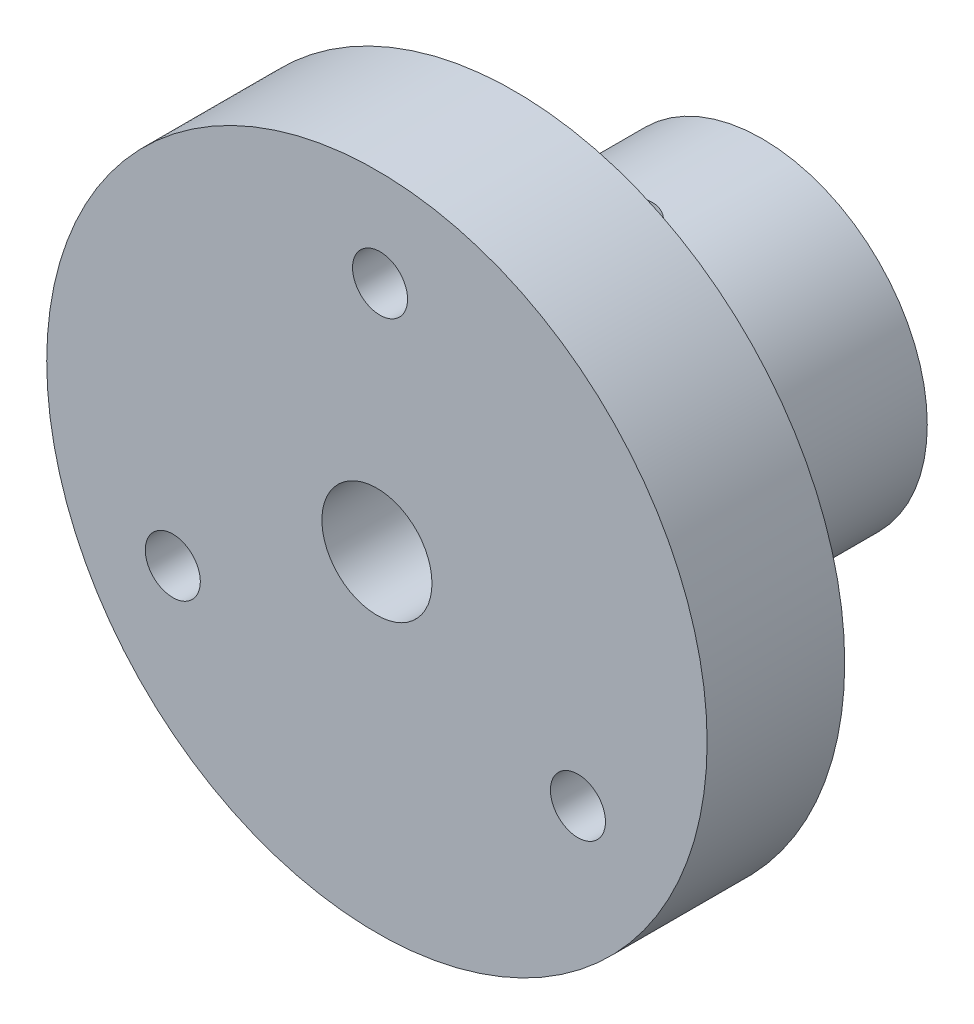
ISO-10303-21;
HEADER;
FILE_DESCRIPTION(('STEP AP214'),'2;1');
FILE_NAME('part.step','',(''),(''),'','','');
FILE_SCHEMA(('AUTOMOTIVE_DESIGN { 1 0 10303 214 1 1 1 1 }'));
ENDSEC;
DATA;
#1=APPLICATION_CONTEXT('core data for automotive mechanical design processes');
#2=APPLICATION_PROTOCOL_DEFINITION('international standard','automotive_design',2000,#1);
#3=PRODUCT_CONTEXT('',#1,'mechanical');
#4=PRODUCT('Part','Part','',(#3));
#5=PRODUCT_RELATED_PRODUCT_CATEGORY('part','',(#4));
#6=PRODUCT_DEFINITION_FORMATION('','',#4);
#7=PRODUCT_DEFINITION_CONTEXT('part definition',#1,'design');
#8=PRODUCT_DEFINITION('design','',#6,#7);
#9=PRODUCT_DEFINITION_SHAPE('','',#8);
#10=(LENGTH_UNIT() NAMED_UNIT(*) SI_UNIT(.MILLI.,.METRE.));
#11=(NAMED_UNIT(*) PLANE_ANGLE_UNIT() SI_UNIT($,.RADIAN.));
#12=(NAMED_UNIT(*) SI_UNIT($,.STERADIAN.) SOLID_ANGLE_UNIT());
#13=UNCERTAINTY_MEASURE_WITH_UNIT(LENGTH_MEASURE(1.E-05),#10,'distance_accuracy_value','');
#14=(GEOMETRIC_REPRESENTATION_CONTEXT(3) GLOBAL_UNCERTAINTY_ASSIGNED_CONTEXT((#13)) GLOBAL_UNIT_ASSIGNED_CONTEXT((#10,
#11,#12)) REPRESENTATION_CONTEXT('',''));
#15=CARTESIAN_POINT('',(0.,0.,0.));
#16=DIRECTION('',(0.,0.,1.));
#17=DIRECTION('',(1.,0.,0.));
#18=AXIS2_PLACEMENT_3D('',#15,#16,#17);
#19=CARTESIAN_POINT('',(-41.1434716879408,10.1614064230343,25.9705627484771));
#20=DIRECTION('',(0.,0.,-1.));
#21=DIRECTION('',(-1.,0.,0.));
#22=AXIS2_PLACEMENT_3D('',#19,#20,#21);
#23=CYLINDRICAL_SURFACE('',#22,6.);
#24=CARTESIAN_POINT('',(-42.1434716879407,16.077486206134,5.));
#25=CARTESIAN_POINT('',(-42.1434694473091,16.0774872126394,4.94424970074159));
#26=CARTESIAN_POINT('',(-42.1387937555557,16.0782827932266,4.88846895759005));
#27=CARTESIAN_POINT('',(-42.1202226591709,16.081376252507,4.77847258271193));
#28=CARTESIAN_POINT('',(-42.1063187520646,16.0836755166,4.72425844250019));
#29=CARTESIAN_POINT('',(-42.0697235054076,16.0895088603236,4.61900308665729));
#30=CARTESIAN_POINT('',(-42.0470395099132,16.0930419077221,4.56795926053347));
#31=CARTESIAN_POINT('',(-41.9935462866969,16.1009435114917,4.47040761811451));
#32=CARTESIAN_POINT('',(-41.9627379733414,16.1053119738242,4.4238992921695));
#33=CARTESIAN_POINT('',(-41.8935466987272,16.1144403076448,4.33627486010173));
#34=CARTESIAN_POINT('',(-41.8550993075136,16.1192032923426,4.29520994744539));
#35=CARTESIAN_POINT('',(-41.7718604898189,16.1285563457122,4.22008267725539));
#36=CARTESIAN_POINT('',(-41.7270686876007,16.1331464041222,4.18602073475386));
#37=CARTESIAN_POINT('',(-41.6320808359201,16.1416693709642,4.12567417311226));
#38=CARTESIAN_POINT('',(-41.5818541205234,16.1455981927634,4.09943719690727));
#39=CARTESIAN_POINT('',(-41.4776299366303,16.1523213708629,4.05579157178779));
#40=CARTESIAN_POINT('',(-41.423632713572,16.155115800925,4.03838234884605));
#41=CARTESIAN_POINT('',(-41.3139291784784,16.1592333619319,4.01304298600644));
#42=CARTESIAN_POINT('',(-41.2582432426124,16.160569835478,4.00502683359812));
#43=CARTESIAN_POINT('',(-41.146301802151,16.1616667404055,3.99843369833896));
#44=CARTESIAN_POINT('',(-41.0900463365292,16.1614272789116,3.99985607390111));
#45=CARTESIAN_POINT('',(-40.9791508139092,16.1594098567599,4.01203254061129));
#46=CARTESIAN_POINT('',(-40.9245002756607,16.1576471578039,4.02269406536366));
#47=CARTESIAN_POINT('',(-40.817774896096,16.1527983381209,4.0529004296986));
#48=CARTESIAN_POINT('',(-40.7657001332801,16.1497121770872,4.0724455398358));
#49=CARTESIAN_POINT('',(-40.6653292288277,16.1425372170822,4.11995625612613));
#50=CARTESIAN_POINT('',(-40.6170514787331,16.1384438923418,4.14796000483298));
#51=CARTESIAN_POINT('',(-40.5258454760021,16.1297093753203,4.21156512905402));
#52=CARTESIAN_POINT('',(-40.4829176567744,16.1250681387109,4.24716711948433));
#53=CARTESIAN_POINT('',(-40.4030831785621,16.1156874959647,4.32547152264772));
#54=CARTESIAN_POINT('',(-40.3662558870395,16.1109475819585,4.36825483796039));
#55=CARTESIAN_POINT('',(-40.3002898525615,16.1019582621735,4.45943483608633));
#56=CARTESIAN_POINT('',(-40.2711511805278,16.0977088609196,4.50783157067313));
#57=CARTESIAN_POINT('',(-40.2213739141454,16.0901814412816,4.60895665675099));
#58=CARTESIAN_POINT('',(-40.200744877029,16.0869045162447,4.66168979923684));
#59=CARTESIAN_POINT('',(-40.1686597396145,16.0817111777938,4.76993962892302));
#60=CARTESIAN_POINT('',(-40.1572028316335,16.0797946445876,4.82545607057297));
#61=CARTESIAN_POINT('',(-40.143898933989,16.0775622607228,4.93698646246486));
#62=CARTESIAN_POINT('',(-40.1419388047758,16.077227566069,4.99298655188085));
#63=CARTESIAN_POINT('',(-40.1473826068678,16.0781465621638,5.10451466867633));
#64=CARTESIAN_POINT('',(-40.1547861764909,16.0794001915617,5.16004271420559));
#65=CARTESIAN_POINT('',(-40.1786507539695,16.0833371728544,5.26869110367635));
#66=CARTESIAN_POINT('',(-40.1950541716822,16.0860114307077,5.32182445595121));
#67=CARTESIAN_POINT('',(-40.2363924118638,16.0924807150563,5.4245880665118));
#68=CARTESIAN_POINT('',(-40.2613277447004,16.0962758085966,5.47421811502036));
#69=CARTESIAN_POINT('',(-40.319289018649,16.1046029366239,5.56906983776245));
#70=CARTESIAN_POINT('',(-40.352387462277,16.1091414454357,5.61424662910242));
#71=CARTESIAN_POINT('',(-40.4256359016575,16.1184250897538,5.698445413078));
#72=CARTESIAN_POINT('',(-40.4657863933871,16.1231702397757,5.7374669724439));
#73=CARTESIAN_POINT('',(-40.5525004598092,16.1323921115074,5.80866075709148));
#74=CARTESIAN_POINT('',(-40.5991263865863,16.136865528413,5.84075753051382));
#75=CARTESIAN_POINT('',(-40.697174308761,16.1449868727661,5.89666213080195));
#76=CARTESIAN_POINT('',(-40.7485961489525,16.1486348269142,5.92047022578954));
#77=CARTESIAN_POINT('',(-40.8545520673402,16.1546798557127,5.95900423358195));
#78=CARTESIAN_POINT('',(-40.9090714628997,16.1570823613048,5.97376963029397));
#79=CARTESIAN_POINT('',(-41.019859393991,16.1603887557115,5.99392623958553));
#80=CARTESIAN_POINT('',(-41.0761277852121,16.161292767835,5.99931822349294));
#81=CARTESIAN_POINT('',(-41.1880881982502,16.1614985745856,6.00055275292487));
#82=CARTESIAN_POINT('',(-41.2437789521818,16.1608196311313,5.99651010157642));
#83=CARTESIAN_POINT('',(-41.3536764776666,16.1579751365835,5.97923843109224));
#84=CARTESIAN_POINT('',(-41.4078832575277,16.1558095938143,5.96600946339617));
#85=CARTESIAN_POINT('',(-41.5132302663082,16.1502343783447,5.93078473378249));
#86=CARTESIAN_POINT('',(-41.5643738368023,16.1468260912006,5.90879873271582));
#87=CARTESIAN_POINT('',(-41.6622638691335,16.1391374505437,5.85669682550792));
#88=CARTESIAN_POINT('',(-41.7090101223877,16.1348570556939,5.82658053397561));
#89=CARTESIAN_POINT('',(-41.7973568661516,16.1258369415102,5.7586659630152));
#90=CARTESIAN_POINT('',(-41.838892260183,16.1210925212373,5.72078361809725));
#91=CARTESIAN_POINT('',(-41.9150572383199,16.1117116362533,5.63858867684072));
#92=CARTESIAN_POINT('',(-41.9496852026212,16.1070751970887,5.59427457644338));
#93=CARTESIAN_POINT('',(-42.0112773963086,16.0983997973147,5.50010187099694));
#94=CARTESIAN_POINT('',(-42.0381856835785,16.0943652949593,5.45020626406478));
#95=CARTESIAN_POINT('',(-42.0831975025171,16.0874032639214,5.34655630563542));
#96=CARTESIAN_POINT('',(-42.1013098300334,16.0844746300394,5.29280587092124));
#97=CARTESIAN_POINT('',(-42.1242821091896,16.0807054023855,5.19903849220933));
#98=CARTESIAN_POINT('',(-42.1314666550088,16.0795049167184,5.15958927681662));
#99=CARTESIAN_POINT('',(-42.1410622060137,16.0778949641804,5.08009860606356));
#100=CARTESIAN_POINT('',(-42.1434732978575,16.0774854829494,5.04005716146793));
#101=CARTESIAN_POINT('',(-42.1434716879407,16.077486206134,5.));
#102=B_SPLINE_CURVE_WITH_KNOTS('',3,(#24,#25,#26,#27,#28,#29,#30,#31,#32,#33,#34,#35,#36,#37,
#38,#39,#40,#41,#42,#43,#44,#45,#46,#47,#48,#49,#50,#51,#52,#53,#54,#55,#56,#57,#58,#59,#60,#61,
#62,#63,#64,#65,#66,#67,#68,#69,#70,#71,#72,#73,#74,#75,#76,#77,#78,#79,#80,#81,#82,#83,#84,#85,
#86,#87,#88,#89,#90,#91,#92,#93,#94,#95,#96,#97,#98,#99,#100,#101),.UNSPECIFIED.,.T.,.F.,(4,2,2,
2,2,2,2,2,2,2,2,2,2,2,2,2,2,2,2,2,2,2,2,2,2,2,2,2,2,2,2,2,2,2,2,2,2,2,4),(0.,0.167104415562128,
0.334363007967781,0.501481999132675,0.66858218960369,0.83715663660545,1.00574107132038,
1.17533192042833,1.34491174042705,1.51292626987286,1.68092937859336,1.84726848464127,
2.01361265698072,2.18071841654029,2.34783770488964,2.51698449383108,2.68613284296667,
2.855470649977,3.0247935437349,3.19209416966423,3.35938833363849,3.52562425852455,
3.69187012915688,3.8596493710334,4.02744041770535,4.19697645212412,4.36650700188938,
4.53529193765317,4.70406298363199,4.87079110504625,5.03751829285788,5.20406015931241,
5.37060992155192,5.53906798983559,5.70756551550983,5.87725491045139,6.0467742669505,
6.16684268214774,6.28690891757995),.UNSPECIFIED.);
#103=CARTESIAN_POINT('',(-42.1434716879407,16.077486206134,5.));
#104=VERTEX_POINT('',#103);
#105=EDGE_CURVE('E76',#104,#104,#102,.T.);
#106=ORIENTED_EDGE('',*,*,#105,.T.);
#107=EDGE_LOOP('',(#106));
#108=FACE_BOUND('',#107,.T.);
#109=CARTESIAN_POINT('',(-41.1434716879408,10.1614064230343,0.));
#110=DIRECTION('',(0.,0.,1.));
#111=DIRECTION('',(1.,0.,0.));
#112=AXIS2_PLACEMENT_3D('',#109,#110,#111);
#113=CIRCLE('',#112,6.);
#114=CARTESIAN_POINT('',(-35.1434716879408,10.1614064230343,0.));
#115=VERTEX_POINT('',#114);
#116=EDGE_CURVE('E54',#115,#115,#113,.T.);
#117=ORIENTED_EDGE('',*,*,#116,.T.);
#118=EDGE_LOOP('',(#117));
#119=FACE_BOUND('',#118,.T.);
#120=CARTESIAN_POINT('',(-41.1434716879408,10.1614064230343,9.));
#121=DIRECTION('',(0.,0.,1.));
#122=DIRECTION('',(1.,0.,0.));
#123=AXIS2_PLACEMENT_3D('',#120,#121,#122);
#124=CIRCLE('',#123,6.);
#125=CARTESIAN_POINT('',(-35.1434716879408,10.1614064230343,9.));
#126=VERTEX_POINT('',#125);
#127=EDGE_CURVE('E12',#126,#126,#124,.T.);
#128=ORIENTED_EDGE('',*,*,#127,.F.);
#129=EDGE_LOOP('',(#128));
#130=FACE_BOUND('',#129,.T.);
#131=ADVANCED_FACE('F42',(#108,#119,#130),#23,.T.);
#132=CARTESIAN_POINT('',(-41.1434716879408,10.1614064230343,0.));
#133=DIRECTION('',(0.,0.,1.));
#134=DIRECTION('',(1.,0.,0.));
#135=AXIS2_PLACEMENT_3D('',#132,#133,#134);
#136=PLANE('',#135);
#137=ORIENTED_EDGE('',*,*,#116,.F.);
#138=EDGE_LOOP('',(#137));
#139=FACE_BOUND('',#138,.T.);
#140=CARTESIAN_POINT('',(-41.1434716879408,10.1614064230343,0.));
#141=DIRECTION('',(0.,0.,1.));
#142=DIRECTION('',(1.,0.,0.));
#143=AXIS2_PLACEMENT_3D('',#140,#141,#142);
#144=CIRCLE('',#143,2.);
#145=CARTESIAN_POINT('',(-39.1434716879408,10.1614064230343,0.));
#146=VERTEX_POINT('',#145);
#147=EDGE_CURVE('E59',#146,#146,#144,.T.);
#148=ORIENTED_EDGE('',*,*,#147,.T.);
#149=EDGE_LOOP('',(#148));
#150=FACE_BOUND('',#149,.T.);
#151=ADVANCED_FACE('F106',(#139,#150),#136,.F.);
#152=CARTESIAN_POINT('',(-41.1434716879408,10.1614064230343,25.9705627484771));
#153=DIRECTION('',(0.,0.,-1.));
#154=DIRECTION('',(-1.,0.,0.));
#155=AXIS2_PLACEMENT_3D('',#152,#153,#154);
#156=CYLINDRICAL_SURFACE('',#155,2.);
#157=CARTESIAN_POINT('',(-42.1434716879408,11.8934572306032,5.));
#158=CARTESIAN_POINT('',(-42.1434680510153,11.8934617703189,4.94789219180475));
#159=CARTESIAN_POINT('',(-42.139371658674,11.8958444349119,4.89571858847495));
#160=CARTESIAN_POINT('',(-42.1231948978388,11.9050300875549,4.79297273532285));
#161=CARTESIAN_POINT('',(-42.1110977524949,11.9118423635899,4.74240408495659));
#162=CARTESIAN_POINT('',(-42.0795716366406,11.9288998890883,4.64454833565606));
#163=CARTESIAN_POINT('',(-42.0601816404345,11.9391268577669,4.59724534752642));
#164=CARTESIAN_POINT('',(-42.0147392133171,11.9618330712029,4.50657579800328));
#165=CARTESIAN_POINT('',(-41.9886864219765,11.974312437795,4.46320944973754));
#166=CARTESIAN_POINT('',(-41.9281382284716,12.0013751136088,4.3776942714425));
#167=CARTESIAN_POINT('',(-41.8931237240845,12.0160470594139,4.33594086432646));
#168=CARTESIAN_POINT('',(-41.8167254955552,12.0451262508914,4.25859161159329));
#169=CARTESIAN_POINT('',(-41.7753386137231,12.0595333613468,4.22299883741648));
#170=CARTESIAN_POINT('',(-41.6839612513553,12.0876211925638,4.15663284885234));
#171=CARTESIAN_POINT('',(-41.6335788769533,12.1011874872161,4.12634623214047));
#172=CARTESIAN_POINT('',(-41.5276287145403,12.1249139840296,4.07485914675424));
#173=CARTESIAN_POINT('',(-41.4720642260789,12.1350763348717,4.05365294386283));
#174=CARTESIAN_POINT('',(-41.3615166318667,12.1502110354767,4.0224953386989));
#175=CARTESIAN_POINT('',(-41.3067734784296,12.1555012252433,4.01185047364447));
#176=CARTESIAN_POINT('',(-41.1960423166386,12.161482261495,3.99983388132496));
#177=CARTESIAN_POINT('',(-41.140055082097,12.1621758908802,3.99845654320429));
#178=CARTESIAN_POINT('',(-41.033639163517,12.1590362421988,4.00474667397035));
#179=CARTESIAN_POINT('',(-40.983150488764,12.1555913819559,4.01163801552123));
#180=CARTESIAN_POINT('',(-40.8841579160224,12.1451488756318,4.03288084390466));
#181=CARTESIAN_POINT('',(-40.8356541668468,12.1381509636983,4.04723288897622));
#182=CARTESIAN_POINT('',(-40.7411622963712,12.1211222559109,4.08308256608982));
#183=CARTESIAN_POINT('',(-40.6952182644256,12.1110508383263,4.10467631317207));
#184=CARTESIAN_POINT('',(-40.6074948864274,12.0887828829012,4.15426341620149));
#185=CARTESIAN_POINT('',(-40.5657170391021,12.0765855846092,4.18225906330235));
#186=CARTESIAN_POINT('',(-40.4832980270426,12.0498503670266,4.24689535153301));
#187=CARTESIAN_POINT('',(-40.4431376129114,12.0352001830161,4.28410302832601));
#188=CARTESIAN_POINT('',(-40.369367317643,12.0059498289024,4.36458972493017));
#189=CARTESIAN_POINT('',(-40.3357624763665,11.9913497056906,4.40787337227406));
#190=CARTESIAN_POINT('',(-40.2739663532986,11.9628479839592,4.50264819242409));
#191=CARTESIAN_POINT('',(-40.2462543729627,11.9490496229414,4.55448602305421));
#192=CARTESIAN_POINT('',(-40.2001525749395,11.9251609258201,4.662937671359));
#193=CARTESIAN_POINT('',(-40.1817530297299,11.915066723495,4.71954643301756));
#194=CARTESIAN_POINT('',(-40.1562914769157,11.9008527812047,4.83121451128279));
#195=CARTESIAN_POINT('',(-40.1484465658208,11.8963229815193,4.88604111904355));
#196=CARTESIAN_POINT('',(-40.1419547413293,11.8925856166504,4.99640134151654));
#197=CARTESIAN_POINT('',(-40.1433013306257,11.8933742919274,5.05193442911979));
#198=CARTESIAN_POINT('',(-40.1544356445968,11.8997497884402,5.15565391857873));
#199=CARTESIAN_POINT('',(-40.1632838712283,11.9048022981009,5.20397945110793));
#200=CARTESIAN_POINT('',(-40.1877754033083,11.9183466385477,5.29836778627096));
#201=CARTESIAN_POINT('',(-40.2034209093172,11.9268395830847,5.34442985074661));
#202=CARTESIAN_POINT('',(-40.2418240993359,11.9467686438309,5.4354113309027));
#203=CARTESIAN_POINT('',(-40.264877624248,11.958322855465,5.48017901685355));
#204=CARTESIAN_POINT('',(-40.317184623925,11.9829676180068,5.56546927153899));
#205=CARTESIAN_POINT('',(-40.3464412836085,11.9960589565858,5.60598964351328));
#206=CARTESIAN_POINT('',(-40.4146345207419,12.0242864075977,5.68697876752355));
#207=CARTESIAN_POINT('',(-40.4543264156258,12.0394722545772,5.72679715071767));
#208=CARTESIAN_POINT('',(-40.5400671925425,12.0687487728133,5.7994122379936));
#209=CARTESIAN_POINT('',(-40.5861182132854,12.0828390731114,5.83220657023054));
#210=CARTESIAN_POINT('',(-40.684936325382,12.1088200399439,5.8905737259501));
#211=CARTESIAN_POINT('',(-40.7378485903667,12.1206428397546,5.91593311821091));
#212=CARTESIAN_POINT('',(-40.8479493232997,12.1402399726273,5.95713790385739));
#213=CARTESIAN_POINT('',(-40.9051339865486,12.1480178597981,5.9729916513663));
#214=CARTESIAN_POINT('',(-41.0164920056103,12.1580815048532,5.99336856417466));
#215=CARTESIAN_POINT('',(-41.0704602440903,12.1608057021162,5.99879787587611));
#216=CARTESIAN_POINT('',(-41.178597673892,12.1618277267856,6.0008432654544));
#217=CARTESIAN_POINT('',(-41.2327667882358,12.1601271037032,5.99746242852356));
#218=CARTESIAN_POINT('',(-41.3360096802579,12.1527461114136,5.98258359320438));
#219=CARTESIAN_POINT('',(-41.385184005752,12.1473353697142,5.97163515074233));
#220=CARTESIAN_POINT('',(-41.4809176401244,12.1333273596686,5.94267300069703));
#221=CARTESIAN_POINT('',(-41.5274765728963,12.1247296343623,5.92465827990654));
#222=CARTESIAN_POINT('',(-41.6188950941856,12.1046657305155,5.88127294783402));
#223=CARTESIAN_POINT('',(-41.6635968306408,12.0930925950223,5.85562067679216));
#224=CARTESIAN_POINT('',(-41.7482463297548,12.0682877544526,5.79804206914095));
#225=CARTESIAN_POINT('',(-41.7881918953557,12.0550552886179,5.76611285088433));
#226=CARTESIAN_POINT('',(-41.8663856920977,12.0266925253006,5.6932028609773));
#227=CARTESIAN_POINT('',(-41.90406937248,12.0115044131513,5.65163751252281));
#228=CARTESIAN_POINT('',(-41.9721349753354,11.9820371846629,5.56254927887023));
#229=CARTESIAN_POINT('',(-42.0025104379508,11.967758880653,5.51502117913232));
#230=CARTESIAN_POINT('',(-42.0559027677264,11.9414024760835,5.41336335341904));
#231=CARTESIAN_POINT('',(-42.0786567539017,11.929408165597,5.35907246887126));
#232=CARTESIAN_POINT('',(-42.1143503974472,11.9100679863179,5.24666759566022));
#233=CARTESIAN_POINT('',(-42.1273228791161,11.9027065845114,5.18856711108731));
#234=CARTESIAN_POINT('',(-42.1378386958052,11.8966991490522,5.108194644348));
#235=CARTESIAN_POINT('',(-42.1399477929046,11.8954877130859,5.08663210560212));
#236=CARTESIAN_POINT('',(-42.1427650930307,11.8938657819118,5.04338351931776));
#237=CARTESIAN_POINT('',(-42.1434732023406,11.8934553402854,5.02169746361413));
#238=CARTESIAN_POINT('',(-42.1434716879408,11.8934572306032,5.));
#239=B_SPLINE_CURVE_WITH_KNOTS('',3,(#157,#158,#159,#160,#161,#162,#163,#164,#165,#166,#167,
#168,#169,#170,#171,#172,#173,#174,#175,#176,#177,#178,#179,#180,#181,#182,#183,#184,#185,#186,
#187,#188,#189,#190,#191,#192,#193,#194,#195,#196,#197,#198,#199,#200,#201,#202,#203,#204,#205,
#206,#207,#208,#209,#210,#211,#212,#213,#214,#215,#216,#217,#218,#219,#220,#221,#222,#223,#224,
#225,#226,#227,#228,#229,#230,#231,#232,#233,#234,#235,#236,#237,#238),.UNSPECIFIED.,.T.,.F.,(4,
2,2,2,2,2,2,2,2,2,2,2,2,2,2,2,2,2,2,2,2,2,2,2,2,2,2,2,2,2,2,2,2,2,2,2,2,2,2,2,4),(0.,
0.156232122594715,0.312792892824804,0.468528595918884,0.624272725445147,0.792862312498229,
0.961535710843712,1.14157892238763,1.32150826963891,1.48863484967935,1.6556602368604,
1.80816097484538,1.96067312517455,2.11529534731147,2.26997299350271,2.4392719145689,
2.60870048245918,2.78888841729448,2.96888774211704,3.13462290854211,3.30024093188372,
3.44774183424025,3.59529052436062,3.74967296406087,3.90413486220047,4.07806743580614,
4.25205864978202,4.43064181412965,4.60906779808771,4.77112270389486,4.9331208679397,
5.08444424871492,5.23578933512012,5.39360750719471,5.55149830100718,5.72510241850066,
5.89885942845153,6.07810749038604,6.25675133002759,6.32180135185308,6.38685572494539),.UNSPECIFIED.);
#240=CARTESIAN_POINT('',(-42.1434716879408,11.8934572306032,5.));
#241=VERTEX_POINT('',#240);
#242=EDGE_CURVE('E46',#241,#241,#239,.T.);
#243=ORIENTED_EDGE('',*,*,#242,.F.);
#244=EDGE_LOOP('',(#243));
#245=FACE_BOUND('',#244,.T.);
#246=ORIENTED_EDGE('',*,*,#147,.F.);
#247=EDGE_LOOP('',(#246));
#248=FACE_BOUND('',#247,.T.);
#249=CARTESIAN_POINT('',(-41.1434716879408,10.1614064230343,14.));
#250=DIRECTION('',(0.,0.,1.));
#251=DIRECTION('',(1.,0.,0.));
#252=AXIS2_PLACEMENT_3D('',#249,#250,#251);
#253=CIRCLE('',#252,2.);
#254=CARTESIAN_POINT('',(-39.1434716879408,10.1614064230343,14.));
#255=VERTEX_POINT('',#254);
#256=EDGE_CURVE('E72',#255,#255,#253,.T.);
#257=ORIENTED_EDGE('',*,*,#256,.T.);
#258=EDGE_LOOP('',(#257));
#259=FACE_BOUND('',#258,.T.);
#260=ADVANCED_FACE('F97',(#245,#248,#259),#156,.F.);
#261=CARTESIAN_POINT('',(-41.1434716879408,10.1614064230343,14.));
#262=DIRECTION('',(0.,0.,1.));
#263=DIRECTION('',(1.,0.,0.));
#264=AXIS2_PLACEMENT_3D('',#261,#262,#263);
#265=PLANE('',#264);
#266=CARTESIAN_POINT('',(-41.0304419092824,18.6614064230343,14.));
#267=DIRECTION('',(0.,0.,1.));
#268=DIRECTION('',(1.,0.,0.));
#269=AXIS2_PLACEMENT_3D('',#266,#267,#268);
#270=CIRCLE('',#269,0.999999999999998);
#271=CARTESIAN_POINT('',(-40.0304419092824,18.6614064230343,14.));
#272=VERTEX_POINT('',#271);
#273=EDGE_CURVE('E187',#272,#272,#270,.T.);
#274=ORIENTED_EDGE('',*,*,#273,.F.);
#275=EDGE_LOOP('',(#274));
#276=FACE_BOUND('',#275,.T.);
#277=CARTESIAN_POINT('',(-33.8387706451019,5.81351976333224,14.));
#278=DIRECTION('',(0.,0.,1.));
#279=DIRECTION('',(1.,0.,0.));
#280=AXIS2_PLACEMENT_3D('',#277,#278,#279);
#281=CIRCLE('',#280,0.999999999999998);
#282=CARTESIAN_POINT('',(-32.8387706451019,5.81351976333224,14.));
#283=VERTEX_POINT('',#282);
#284=EDGE_CURVE('E192',#283,#283,#281,.T.);
#285=ORIENTED_EDGE('',*,*,#284,.F.);
#286=EDGE_LOOP('',(#285));
#287=FACE_BOUND('',#286,.T.);
#288=CARTESIAN_POINT('',(-48.5612025094374,6.00929308273634,14.));
#289=DIRECTION('',(0.,0.,1.));
#290=DIRECTION('',(1.,0.,0.));
#291=AXIS2_PLACEMENT_3D('',#288,#289,#290);
#292=CIRCLE('',#291,0.999999999999998);
#293=CARTESIAN_POINT('',(-47.5612025094374,6.00929308273634,14.));
#294=VERTEX_POINT('',#293);
#295=EDGE_CURVE('E196',#294,#294,#292,.T.);
#296=ORIENTED_EDGE('',*,*,#295,.F.);
#297=EDGE_LOOP('',(#296));
#298=FACE_BOUND('',#297,.T.);
#299=CARTESIAN_POINT('',(-41.1434716879408,10.1614064230343,14.));
#300=DIRECTION('',(0.,0.,1.));
#301=DIRECTION('',(1.,0.,0.));
#302=AXIS2_PLACEMENT_3D('',#299,#300,#301);
#303=CIRCLE('',#302,12.);
#304=CARTESIAN_POINT('',(-29.1434716879408,10.1614064230343,14.));
#305=VERTEX_POINT('',#304);
#306=EDGE_CURVE('E65',#305,#305,#303,.T.);
#307=ORIENTED_EDGE('',*,*,#306,.T.);
#308=EDGE_LOOP('',(#307));
#309=FACE_BOUND('',#308,.T.);
#310=ORIENTED_EDGE('',*,*,#256,.F.);
#311=EDGE_LOOP('',(#310));
#312=FACE_BOUND('',#311,.T.);
#313=ADVANCED_FACE('F92',(#276,#287,#298,#309,#312),#265,.T.);
#314=CARTESIAN_POINT('',(-41.1434716879408,10.1614064230343,9.));
#315=DIRECTION('',(0.,0.,1.));
#316=DIRECTION('',(1.,0.,0.));
#317=AXIS2_PLACEMENT_3D('',#314,#315,#316);
#318=PLANE('',#317);
#319=CARTESIAN_POINT('',(-41.0304419092824,18.6614064230343,9.));
#320=DIRECTION('',(0.,0.,1.));
#321=DIRECTION('',(1.,0.,0.));
#322=AXIS2_PLACEMENT_3D('',#319,#320,#321);
#323=CIRCLE('',#322,0.999999999999998);
#324=CARTESIAN_POINT('',(-40.0304419092824,18.6614064230343,9.));
#325=VERTEX_POINT('',#324);
#326=EDGE_CURVE('E184',#325,#325,#323,.F.);
#327=ORIENTED_EDGE('',*,*,#326,.F.);
#328=EDGE_LOOP('',(#327));
#329=FACE_BOUND('',#328,.T.);
#330=CARTESIAN_POINT('',(-33.8387706451019,5.81351976333224,9.));
#331=DIRECTION('',(0.,0.,1.));
#332=DIRECTION('',(1.,0.,0.));
#333=AXIS2_PLACEMENT_3D('',#330,#331,#332);
#334=CIRCLE('',#333,0.999999999999998);
#335=CARTESIAN_POINT('',(-32.8387706451019,5.81351976333224,9.));
#336=VERTEX_POINT('',#335);
#337=EDGE_CURVE('E188',#336,#336,#334,.F.);
#338=ORIENTED_EDGE('',*,*,#337,.F.);
#339=EDGE_LOOP('',(#338));
#340=FACE_BOUND('',#339,.T.);
#341=CARTESIAN_POINT('',(-48.5612025094374,6.00929308273634,9.));
#342=DIRECTION('',(0.,0.,1.));
#343=DIRECTION('',(1.,0.,0.));
#344=AXIS2_PLACEMENT_3D('',#341,#342,#343);
#345=CIRCLE('',#344,0.999999999999998);
#346=CARTESIAN_POINT('',(-47.5612025094374,6.00929308273634,9.));
#347=VERTEX_POINT('',#346);
#348=EDGE_CURVE('E81',#347,#347,#345,.F.);
#349=ORIENTED_EDGE('',*,*,#348,.F.);
#350=EDGE_LOOP('',(#349));
#351=FACE_BOUND('',#350,.T.);
#352=ORIENTED_EDGE('',*,*,#127,.T.);
#353=EDGE_LOOP('',(#352));
#354=FACE_BOUND('',#353,.T.);
#355=CARTESIAN_POINT('',(-41.1434716879408,10.1614064230343,9.));
#356=DIRECTION('',(0.,0.,1.));
#357=DIRECTION('',(1.,0.,0.));
#358=AXIS2_PLACEMENT_3D('',#355,#356,#357);
#359=CIRCLE('',#358,12.);
#360=CARTESIAN_POINT('',(-29.1434716879408,10.1614064230343,9.));
#361=VERTEX_POINT('',#360);
#362=EDGE_CURVE('E62',#361,#361,#359,.T.);
#363=ORIENTED_EDGE('',*,*,#362,.F.);
#364=EDGE_LOOP('',(#363));
#365=FACE_BOUND('',#364,.T.);
#366=ADVANCED_FACE('F96',(#329,#340,#351,#354,#365),#318,.F.);
#367=CARTESIAN_POINT('',(-41.1434716879408,10.1614064230343,14.));
#368=DIRECTION('',(0.,0.,-1.));
#369=DIRECTION('',(-1.,0.,0.));
#370=AXIS2_PLACEMENT_3D('',#367,#368,#369);
#371=CYLINDRICAL_SURFACE('',#370,12.);
#372=ORIENTED_EDGE('',*,*,#306,.F.);
#373=EDGE_LOOP('',(#372));
#374=FACE_BOUND('',#373,.T.);
#375=ORIENTED_EDGE('',*,*,#362,.T.);
#376=EDGE_LOOP('',(#375));
#377=FACE_BOUND('',#376,.T.);
#378=ADVANCED_FACE('F89',(#374,#377),#371,.T.);
#379=CARTESIAN_POINT('',(-41.1434716879408,10.8114064230343,5.));
#380=DIRECTION('',(0.,1.,0.));
#381=DIRECTION('',(-1.,0.,0.));
#382=AXIS2_PLACEMENT_3D('',#379,#380,#381);
#383=CYLINDRICAL_SURFACE('',#382,0.999999999999998);
#384=ORIENTED_EDGE('',*,*,#242,.T.);
#385=EDGE_LOOP('',(#384));
#386=FACE_BOUND('',#385,.T.);
#387=ORIENTED_EDGE('',*,*,#105,.F.);
#388=EDGE_LOOP('',(#387));
#389=FACE_BOUND('',#388,.T.);
#390=ADVANCED_FACE('F83',(#386,#389),#383,.F.);
#391=CARTESIAN_POINT('',(-48.5612025094374,6.00929308273634,6.17157287525381));
#392=DIRECTION('',(0.,0.,1.));
#393=DIRECTION('',(1.,0.,0.));
#394=AXIS2_PLACEMENT_3D('',#391,#392,#393);
#395=CYLINDRICAL_SURFACE('',#394,0.999999999999998);
#396=ORIENTED_EDGE('',*,*,#348,.T.);
#397=EDGE_LOOP('',(#396));
#398=FACE_BOUND('',#397,.T.);
#399=ORIENTED_EDGE('',*,*,#295,.T.);
#400=EDGE_LOOP('',(#399));
#401=FACE_BOUND('',#400,.T.);
#402=ADVANCED_FACE('F88',(#398,#401),#395,.F.);
#403=CARTESIAN_POINT('',(-33.8387706451019,5.81351976333224,6.17157287525381));
#404=DIRECTION('',(0.,0.,1.));
#405=DIRECTION('',(1.,0.,0.));
#406=AXIS2_PLACEMENT_3D('',#403,#404,#405);
#407=CYLINDRICAL_SURFACE('',#406,0.999999999999998);
#408=ORIENTED_EDGE('',*,*,#337,.T.);
#409=EDGE_LOOP('',(#408));
#410=FACE_BOUND('',#409,.T.);
#411=ORIENTED_EDGE('',*,*,#284,.T.);
#412=EDGE_LOOP('',(#411));
#413=FACE_BOUND('',#412,.T.);
#414=ADVANCED_FACE('F159',(#410,#413),#407,.F.);
#415=CARTESIAN_POINT('',(-41.0304419092824,18.6614064230343,6.17157287525381));
#416=DIRECTION('',(0.,0.,1.));
#417=DIRECTION('',(1.,0.,0.));
#418=AXIS2_PLACEMENT_3D('',#415,#416,#417);
#419=CYLINDRICAL_SURFACE('',#418,0.999999999999998);
#420=ORIENTED_EDGE('',*,*,#326,.T.);
#421=EDGE_LOOP('',(#420));
#422=FACE_BOUND('',#421,.T.);
#423=ORIENTED_EDGE('',*,*,#273,.T.);
#424=EDGE_LOOP('',(#423));
#425=FACE_BOUND('',#424,.T.);
#426=ADVANCED_FACE('F168',(#422,#425),#419,.F.);
#427=CLOSED_SHELL('',(#131,#151,#260,#313,#366,#378,#390,#402,#414,#426));
#428=MANIFOLD_SOLID_BREP('B2',#427);
#429=ADVANCED_BREP_SHAPE_REPRESENTATION('',(#18,#428),#14);
#430=SHAPE_DEFINITION_REPRESENTATION(#9,#429);
ENDSEC;
END-ISO-10303-21;
